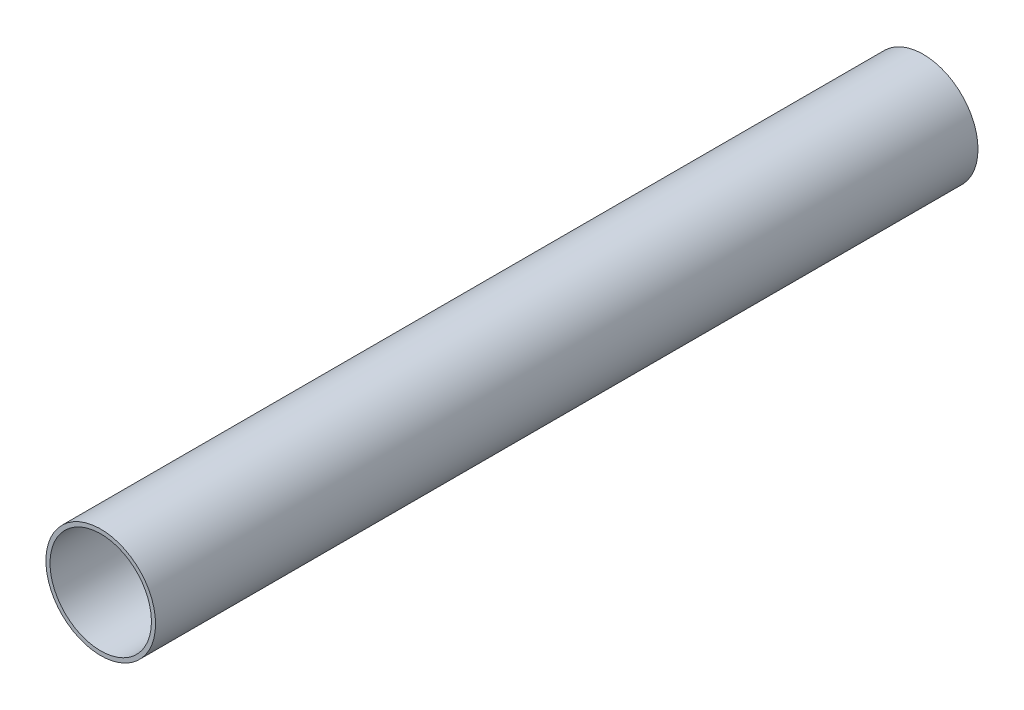
ISO-10303-21;
HEADER;
FILE_DESCRIPTION(('STEP AP214'),'2;1');
FILE_NAME('part.step','',(''),(''),'','','');
FILE_SCHEMA(('AUTOMOTIVE_DESIGN { 1 0 10303 214 1 1 1 1 }'));
ENDSEC;
DATA;
#1=APPLICATION_CONTEXT('core data for automotive mechanical design processes');
#2=APPLICATION_PROTOCOL_DEFINITION('international standard','automotive_design',2000,#1);
#3=PRODUCT_CONTEXT('',#1,'mechanical');
#4=PRODUCT('Part','Part','',(#3));
#5=PRODUCT_RELATED_PRODUCT_CATEGORY('part','',(#4));
#6=PRODUCT_DEFINITION_FORMATION('','',#4);
#7=PRODUCT_DEFINITION_CONTEXT('part definition',#1,'design');
#8=PRODUCT_DEFINITION('design','',#6,#7);
#9=PRODUCT_DEFINITION_SHAPE('','',#8);
#10=(LENGTH_UNIT() NAMED_UNIT(*) SI_UNIT(.MILLI.,.METRE.));
#11=(NAMED_UNIT(*) PLANE_ANGLE_UNIT() SI_UNIT($,.RADIAN.));
#12=(NAMED_UNIT(*) SI_UNIT($,.STERADIAN.) SOLID_ANGLE_UNIT());
#13=UNCERTAINTY_MEASURE_WITH_UNIT(LENGTH_MEASURE(1.E-05),#10,'distance_accuracy_value','');
#14=(GEOMETRIC_REPRESENTATION_CONTEXT(3) GLOBAL_UNCERTAINTY_ASSIGNED_CONTEXT((#13)) GLOBAL_UNIT_ASSIGNED_CONTEXT((#10,
#11,#12)) REPRESENTATION_CONTEXT('',''));
#15=CARTESIAN_POINT('',(0.,0.,0.));
#16=DIRECTION('',(0.,0.,1.));
#17=DIRECTION('',(1.,0.,0.));
#18=AXIS2_PLACEMENT_3D('',#15,#16,#17);
#19=CARTESIAN_POINT('',(0.,0.,150.));
#20=DIRECTION('',(0.,0.,1.));
#21=DIRECTION('',(1.,0.,0.));
#22=AXIS2_PLACEMENT_3D('',#19,#20,#21);
#23=PLANE('',#22);
#24=CARTESIAN_POINT('',(0.,0.,150.));
#25=DIRECTION('',(0.,0.,1.));
#26=DIRECTION('',(1.,0.,0.));
#27=AXIS2_PLACEMENT_3D('',#24,#25,#26);
#28=CIRCLE('',#27,20.);
#29=CARTESIAN_POINT('',(20.,0.,150.));
#30=VERTEX_POINT('',#29);
#31=EDGE_CURVE('E10',#30,#30,#28,.T.);
#32=ORIENTED_EDGE('',*,*,#31,.T.);
#33=EDGE_LOOP('',(#32));
#34=FACE_BOUND('',#33,.T.);
#35=CARTESIAN_POINT('',(0.,0.,150.));
#36=DIRECTION('',(0.,0.,1.));
#37=DIRECTION('',(1.,0.,0.));
#38=AXIS2_PLACEMENT_3D('',#35,#36,#37);
#39=CIRCLE('',#38,18.5);
#40=CARTESIAN_POINT('',(18.5,0.,150.));
#41=VERTEX_POINT('',#40);
#42=EDGE_CURVE('E54',#41,#41,#39,.T.);
#43=ORIENTED_EDGE('',*,*,#42,.F.);
#44=EDGE_LOOP('',(#43));
#45=FACE_BOUND('',#44,.T.);
#46=ADVANCED_FACE('F41',(#34,#45),#23,.T.);
#47=CARTESIAN_POINT('',(0.,0.,-150.));
#48=DIRECTION('',(0.,0.,1.));
#49=DIRECTION('',(1.,0.,0.));
#50=AXIS2_PLACEMENT_3D('',#47,#48,#49);
#51=PLANE('',#50);
#52=CARTESIAN_POINT('',(0.,0.,-150.));
#53=DIRECTION('',(0.,0.,1.));
#54=DIRECTION('',(1.,0.,0.));
#55=AXIS2_PLACEMENT_3D('',#52,#53,#54);
#56=CIRCLE('',#55,20.);
#57=CARTESIAN_POINT('',(20.,0.,-150.));
#58=VERTEX_POINT('',#57);
#59=EDGE_CURVE('E45',#58,#58,#56,.T.);
#60=ORIENTED_EDGE('',*,*,#59,.F.);
#61=EDGE_LOOP('',(#60));
#62=FACE_BOUND('',#61,.T.);
#63=CARTESIAN_POINT('',(0.,0.,-150.));
#64=DIRECTION('',(0.,0.,1.));
#65=DIRECTION('',(1.,0.,0.));
#66=AXIS2_PLACEMENT_3D('',#63,#64,#65);
#67=CIRCLE('',#66,18.5);
#68=CARTESIAN_POINT('',(18.5,0.,-150.));
#69=VERTEX_POINT('',#68);
#70=EDGE_CURVE('E56',#69,#69,#67,.T.);
#71=ORIENTED_EDGE('',*,*,#70,.T.);
#72=EDGE_LOOP('',(#71));
#73=FACE_BOUND('',#72,.T.);
#74=ADVANCED_FACE('F68',(#62,#73),#51,.F.);
#75=CARTESIAN_POINT('',(0.,0.,150.));
#76=DIRECTION('',(0.,0.,-1.));
#77=DIRECTION('',(-1.,0.,0.));
#78=AXIS2_PLACEMENT_3D('',#75,#76,#77);
#79=CYLINDRICAL_SURFACE('',#78,20.);
#80=ORIENTED_EDGE('',*,*,#31,.F.);
#81=EDGE_LOOP('',(#80));
#82=FACE_BOUND('',#81,.T.);
#83=ORIENTED_EDGE('',*,*,#59,.T.);
#84=EDGE_LOOP('',(#83));
#85=FACE_BOUND('',#84,.T.);
#86=ADVANCED_FACE('F43',(#82,#85),#79,.T.);
#87=CARTESIAN_POINT('',(0.,0.,150.));
#88=DIRECTION('',(0.,0.,-1.));
#89=DIRECTION('',(-1.,0.,0.));
#90=AXIS2_PLACEMENT_3D('',#87,#88,#89);
#91=CYLINDRICAL_SURFACE('',#90,18.5);
#92=ORIENTED_EDGE('',*,*,#42,.T.);
#93=EDGE_LOOP('',(#92));
#94=FACE_BOUND('',#93,.T.);
#95=ORIENTED_EDGE('',*,*,#70,.F.);
#96=EDGE_LOOP('',(#95));
#97=FACE_BOUND('',#96,.T.);
#98=ADVANCED_FACE('F64',(#94,#97),#91,.F.);
#99=CLOSED_SHELL('',(#46,#74,#86,#98));
#100=MANIFOLD_SOLID_BREP('B2',#99);
#101=ADVANCED_BREP_SHAPE_REPRESENTATION('',(#18,#100),#14);
#102=SHAPE_DEFINITION_REPRESENTATION(#9,#101);
ENDSEC;
END-ISO-10303-21;
